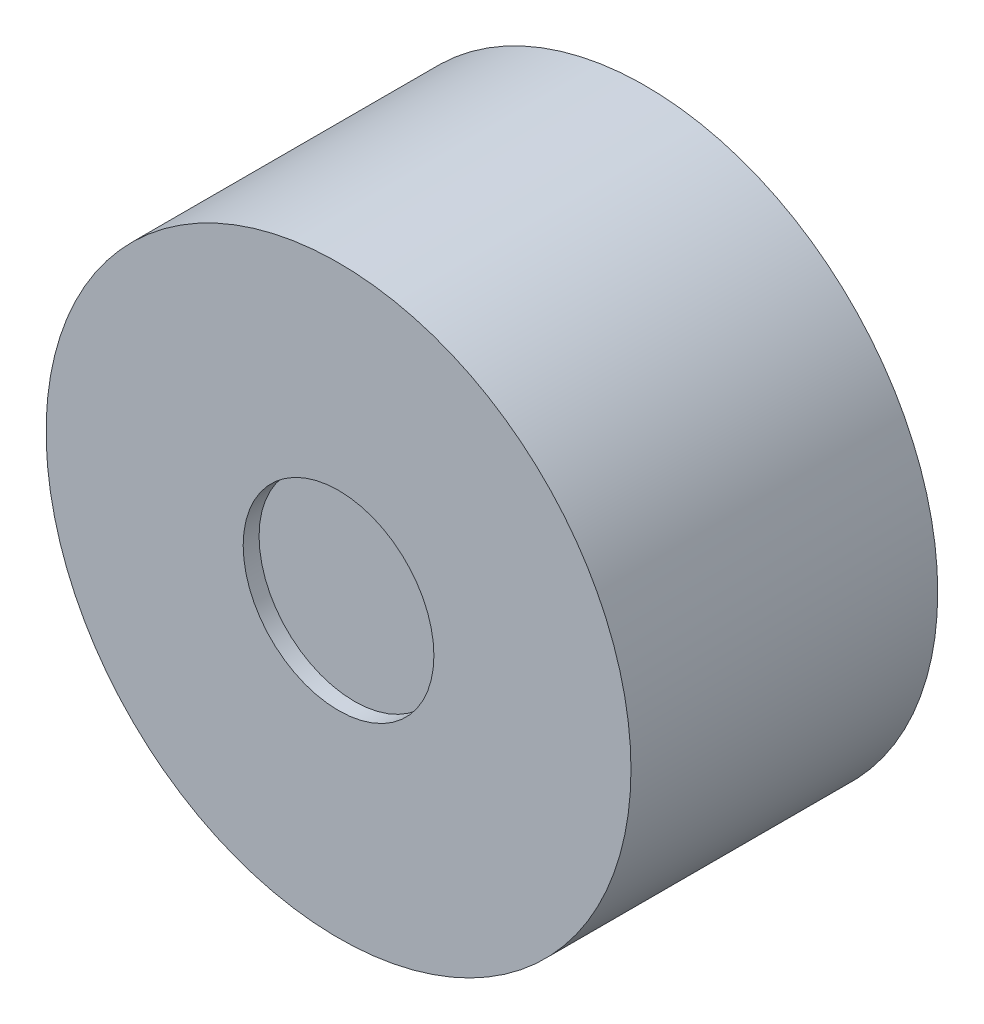
ISO-10303-21;
HEADER;
FILE_DESCRIPTION(('STEP AP214'),'2;1');
FILE_NAME('part.step','',(''),(''),'','','');
FILE_SCHEMA(('AUTOMOTIVE_DESIGN { 1 0 10303 214 1 1 1 1 }'));
ENDSEC;
DATA;
#1=APPLICATION_CONTEXT('core data for automotive mechanical design processes');
#2=APPLICATION_PROTOCOL_DEFINITION('international standard','automotive_design',2000,#1);
#3=PRODUCT_CONTEXT('',#1,'mechanical');
#4=PRODUCT('Part','Part','',(#3));
#5=PRODUCT_RELATED_PRODUCT_CATEGORY('part','',(#4));
#6=PRODUCT_DEFINITION_FORMATION('','',#4);
#7=PRODUCT_DEFINITION_CONTEXT('part definition',#1,'design');
#8=PRODUCT_DEFINITION('design','',#6,#7);
#9=PRODUCT_DEFINITION_SHAPE('','',#8);
#10=(LENGTH_UNIT() NAMED_UNIT(*) SI_UNIT(.MILLI.,.METRE.));
#11=(NAMED_UNIT(*) PLANE_ANGLE_UNIT() SI_UNIT($,.RADIAN.));
#12=(NAMED_UNIT(*) SI_UNIT($,.STERADIAN.) SOLID_ANGLE_UNIT());
#13=UNCERTAINTY_MEASURE_WITH_UNIT(LENGTH_MEASURE(1.E-05),#10,'distance_accuracy_value','');
#14=(GEOMETRIC_REPRESENTATION_CONTEXT(3) GLOBAL_UNCERTAINTY_ASSIGNED_CONTEXT((#13)) GLOBAL_UNIT_ASSIGNED_CONTEXT((#10,
#11,#12)) REPRESENTATION_CONTEXT('',''));
#15=CARTESIAN_POINT('',(0.,0.,0.));
#16=DIRECTION('',(0.,0.,1.));
#17=DIRECTION('',(1.,0.,0.));
#18=AXIS2_PLACEMENT_3D('',#15,#16,#17);
#19=CARTESIAN_POINT('',(0.,0.,24.3));
#20=DIRECTION('',(0.,0.,-1.));
#21=DIRECTION('',(-1.,0.,0.));
#22=AXIS2_PLACEMENT_3D('',#19,#20,#21);
#23=CYLINDRICAL_SURFACE('',#22,18.4);
#24=CARTESIAN_POINT('',(0.,0.,0.));
#25=DIRECTION('',(0.,0.,1.));
#26=DIRECTION('',(1.,0.,0.));
#27=AXIS2_PLACEMENT_3D('',#24,#25,#26);
#28=CIRCLE('',#27,18.4);
#29=CARTESIAN_POINT('',(18.4,0.,0.));
#30=VERTEX_POINT('',#29);
#31=EDGE_CURVE('E10',#30,#30,#28,.T.);
#32=ORIENTED_EDGE('',*,*,#31,.T.);
#33=EDGE_LOOP('',(#32));
#34=FACE_BOUND('',#33,.T.);
#35=CARTESIAN_POINT('',(0.,0.,19.3));
#36=DIRECTION('',(0.,0.,1.));
#37=DIRECTION('',(1.,0.,0.));
#38=AXIS2_PLACEMENT_3D('',#35,#36,#37);
#39=CIRCLE('',#38,18.4);
#40=CARTESIAN_POINT('',(18.4,0.,19.3));
#41=VERTEX_POINT('',#40);
#42=EDGE_CURVE('E53',#41,#41,#39,.T.);
#43=ORIENTED_EDGE('',*,*,#42,.F.);
#44=EDGE_LOOP('',(#43));
#45=FACE_BOUND('',#44,.T.);
#46=ADVANCED_FACE('F35',(#34,#45),#23,.T.);
#47=CARTESIAN_POINT('',(0.,0.,0.));
#48=DIRECTION('',(0.,0.,1.));
#49=DIRECTION('',(1.,0.,0.));
#50=AXIS2_PLACEMENT_3D('',#47,#48,#49);
#51=PLANE('',#50);
#52=CARTESIAN_POINT('',(10.,0.,0.));
#53=DIRECTION('',(0.,0.,-1.));
#54=DIRECTION('',(-1.,0.,0.));
#55=AXIS2_PLACEMENT_3D('',#52,#53,#54);
#56=CIRCLE('',#55,1.25);
#57=CARTESIAN_POINT('',(8.75,0.,0.));
#58=VERTEX_POINT('',#57);
#59=EDGE_CURVE('E45',#58,#58,#56,.T.);
#60=ORIENTED_EDGE('',*,*,#59,.F.);
#61=EDGE_LOOP('',(#60));
#62=FACE_BOUND('',#61,.T.);
#63=CARTESIAN_POINT('',(0.,10.,0.));
#64=DIRECTION('',(0.,0.,-1.));
#65=DIRECTION('',(-1.,0.,0.));
#66=AXIS2_PLACEMENT_3D('',#63,#64,#65);
#67=CIRCLE('',#66,1.25);
#68=CARTESIAN_POINT('',(-1.25000000000003,10.,0.));
#69=VERTEX_POINT('',#68);
#70=EDGE_CURVE('E58',#69,#69,#67,.T.);
#71=ORIENTED_EDGE('',*,*,#70,.F.);
#72=EDGE_LOOP('',(#71));
#73=FACE_BOUND('',#72,.T.);
#74=CARTESIAN_POINT('',(-10.,0.,0.));
#75=DIRECTION('',(0.,0.,-1.));
#76=DIRECTION('',(-1.,0.,0.));
#77=AXIS2_PLACEMENT_3D('',#74,#75,#76);
#78=CIRCLE('',#77,1.25);
#79=CARTESIAN_POINT('',(-11.25,0.,0.));
#80=VERTEX_POINT('',#79);
#81=EDGE_CURVE('E64',#80,#80,#78,.T.);
#82=ORIENTED_EDGE('',*,*,#81,.F.);
#83=EDGE_LOOP('',(#82));
#84=FACE_BOUND('',#83,.T.);
#85=CARTESIAN_POINT('',(1.04744440165294E-13,-10.,0.));
#86=DIRECTION('',(0.,0.,-1.));
#87=DIRECTION('',(-1.,0.,0.));
#88=AXIS2_PLACEMENT_3D('',#85,#86,#87);
#89=CIRCLE('',#88,1.25);
#90=CARTESIAN_POINT('',(-1.24999999999989,-10.,0.));
#91=VERTEX_POINT('',#90);
#92=EDGE_CURVE('E69',#91,#91,#89,.T.);
#93=ORIENTED_EDGE('',*,*,#92,.F.);
#94=EDGE_LOOP('',(#93));
#95=FACE_BOUND('',#94,.T.);
#96=ORIENTED_EDGE('',*,*,#31,.F.);
#97=EDGE_LOOP('',(#96));
#98=FACE_BOUND('',#97,.T.);
#99=ADVANCED_FACE('F102',(#62,#73,#84,#95,#98),#51,.F.);
#100=CARTESIAN_POINT('',(1.04744440165294E-13,-10.,5.));
#101=DIRECTION('',(0.,0.,-1.));
#102=DIRECTION('',(-1.,0.,0.));
#103=AXIS2_PLACEMENT_3D('',#100,#101,#102);
#104=CYLINDRICAL_SURFACE('',#103,1.25);
#105=CARTESIAN_POINT('',(1.04744440165294E-13,-10.,5.));
#106=DIRECTION('',(0.,0.,-1.));
#107=DIRECTION('',(-1.,0.,0.));
#108=AXIS2_PLACEMENT_3D('',#105,#106,#107);
#109=CIRCLE('',#108,1.25);
#110=CARTESIAN_POINT('',(-1.24999999999989,-10.,5.));
#111=VERTEX_POINT('',#110);
#112=EDGE_CURVE('E67',#111,#111,#109,.T.);
#113=ORIENTED_EDGE('',*,*,#112,.F.);
#114=EDGE_LOOP('',(#113));
#115=FACE_BOUND('',#114,.T.);
#116=ORIENTED_EDGE('',*,*,#92,.T.);
#117=EDGE_LOOP('',(#116));
#118=FACE_BOUND('',#117,.T.);
#119=ADVANCED_FACE('F106',(#115,#118),#104,.F.);
#120=CARTESIAN_POINT('',(1.04744440165294E-13,-10.,5.));
#121=DIRECTION('',(0.,0.,-1.));
#122=DIRECTION('',(-1.,0.,0.));
#123=AXIS2_PLACEMENT_3D('',#120,#121,#122);
#124=PLANE('',#123);
#125=ORIENTED_EDGE('',*,*,#112,.T.);
#126=EDGE_LOOP('',(#125));
#127=FACE_BOUND('',#126,.T.);
#128=ADVANCED_FACE('F112',(#127),#124,.T.);
#129=CARTESIAN_POINT('',(-10.,0.,5.));
#130=DIRECTION('',(0.,0.,-1.));
#131=DIRECTION('',(-1.,0.,0.));
#132=AXIS2_PLACEMENT_3D('',#129,#130,#131);
#133=CYLINDRICAL_SURFACE('',#132,1.25);
#134=CARTESIAN_POINT('',(-10.,0.,5.));
#135=DIRECTION('',(0.,0.,-1.));
#136=DIRECTION('',(-1.,0.,0.));
#137=AXIS2_PLACEMENT_3D('',#134,#135,#136);
#138=CIRCLE('',#137,1.25);
#139=CARTESIAN_POINT('',(-11.25,0.,5.));
#140=VERTEX_POINT('',#139);
#141=EDGE_CURVE('E61',#140,#140,#138,.T.);
#142=ORIENTED_EDGE('',*,*,#141,.F.);
#143=EDGE_LOOP('',(#142));
#144=FACE_BOUND('',#143,.T.);
#145=ORIENTED_EDGE('',*,*,#81,.T.);
#146=EDGE_LOOP('',(#145));
#147=FACE_BOUND('',#146,.T.);
#148=ADVANCED_FACE('F122',(#144,#147),#133,.F.);
#149=CARTESIAN_POINT('',(-10.,0.,5.));
#150=DIRECTION('',(0.,0.,-1.));
#151=DIRECTION('',(-1.,0.,0.));
#152=AXIS2_PLACEMENT_3D('',#149,#150,#151);
#153=PLANE('',#152);
#154=ORIENTED_EDGE('',*,*,#141,.T.);
#155=EDGE_LOOP('',(#154));
#156=FACE_BOUND('',#155,.T.);
#157=ADVANCED_FACE('F124',(#156),#153,.T.);
#158=CARTESIAN_POINT('',(0.,10.,5.));
#159=DIRECTION('',(0.,0.,-1.));
#160=DIRECTION('',(-1.,0.,0.));
#161=AXIS2_PLACEMENT_3D('',#158,#159,#160);
#162=CYLINDRICAL_SURFACE('',#161,1.25);
#163=CARTESIAN_POINT('',(0.,10.,5.));
#164=DIRECTION('',(0.,0.,-1.));
#165=DIRECTION('',(-1.,0.,0.));
#166=AXIS2_PLACEMENT_3D('',#163,#164,#165);
#167=CIRCLE('',#166,1.25);
#168=CARTESIAN_POINT('',(-1.25000000000003,10.,5.));
#169=VERTEX_POINT('',#168);
#170=EDGE_CURVE('E50',#169,#169,#167,.T.);
#171=ORIENTED_EDGE('',*,*,#170,.F.);
#172=EDGE_LOOP('',(#171));
#173=FACE_BOUND('',#172,.T.);
#174=ORIENTED_EDGE('',*,*,#70,.T.);
#175=EDGE_LOOP('',(#174));
#176=FACE_BOUND('',#175,.T.);
#177=ADVANCED_FACE('F131',(#173,#176),#162,.F.);
#178=CARTESIAN_POINT('',(0.,10.,5.));
#179=DIRECTION('',(0.,0.,-1.));
#180=DIRECTION('',(-1.,0.,0.));
#181=AXIS2_PLACEMENT_3D('',#178,#179,#180);
#182=PLANE('',#181);
#183=ORIENTED_EDGE('',*,*,#170,.T.);
#184=EDGE_LOOP('',(#183));
#185=FACE_BOUND('',#184,.T.);
#186=ADVANCED_FACE('F140',(#185),#182,.T.);
#187=CARTESIAN_POINT('',(10.,0.,5.));
#188=DIRECTION('',(0.,0.,-1.));
#189=DIRECTION('',(-1.,0.,0.));
#190=AXIS2_PLACEMENT_3D('',#187,#188,#189);
#191=CYLINDRICAL_SURFACE('',#190,1.25);
#192=CARTESIAN_POINT('',(10.,0.,5.));
#193=DIRECTION('',(0.,0.,-1.));
#194=DIRECTION('',(-1.,0.,0.));
#195=AXIS2_PLACEMENT_3D('',#192,#193,#194);
#196=CIRCLE('',#195,1.25);
#197=CARTESIAN_POINT('',(8.75,0.,5.));
#198=VERTEX_POINT('',#197);
#199=EDGE_CURVE('E41',#198,#198,#196,.T.);
#200=ORIENTED_EDGE('',*,*,#199,.F.);
#201=EDGE_LOOP('',(#200));
#202=FACE_BOUND('',#201,.T.);
#203=ORIENTED_EDGE('',*,*,#59,.T.);
#204=EDGE_LOOP('',(#203));
#205=FACE_BOUND('',#204,.T.);
#206=ADVANCED_FACE('F98',(#202,#205),#191,.F.);
#207=CARTESIAN_POINT('',(10.,0.,5.));
#208=DIRECTION('',(0.,0.,-1.));
#209=DIRECTION('',(-1.,0.,0.));
#210=AXIS2_PLACEMENT_3D('',#207,#208,#209);
#211=PLANE('',#210);
#212=ORIENTED_EDGE('',*,*,#199,.T.);
#213=EDGE_LOOP('',(#212));
#214=FACE_BOUND('',#213,.T.);
#215=ADVANCED_FACE('F89',(#214),#211,.T.);
#216=CARTESIAN_POINT('',(0.,9.5,19.3));
#217=DIRECTION('',(0.,0.,1.));
#218=DIRECTION('',(1.,0.,0.));
#219=AXIS2_PLACEMENT_3D('',#216,#217,#218);
#220=PLANE('',#219);
#221=CARTESIAN_POINT('',(0.,0.,19.3));
#222=DIRECTION('',(0.,0.,1.));
#223=DIRECTION('',(1.,0.,0.));
#224=AXIS2_PLACEMENT_3D('',#221,#222,#223);
#225=CIRCLE('',#224,6.);
#226=CARTESIAN_POINT('',(6.,0.,19.3));
#227=VERTEX_POINT('',#226);
#228=EDGE_CURVE('E78',#227,#227,#225,.T.);
#229=ORIENTED_EDGE('',*,*,#228,.F.);
#230=EDGE_LOOP('',(#229));
#231=FACE_BOUND('',#230,.T.);
#232=ORIENTED_EDGE('',*,*,#42,.T.);
#233=EDGE_LOOP('',(#232));
#234=FACE_BOUND('',#233,.T.);
#235=ADVANCED_FACE('F87',(#231,#234),#220,.T.);
#236=CARTESIAN_POINT('',(0.,0.,18.3));
#237=DIRECTION('',(0.,0.,1.));
#238=DIRECTION('',(1.,0.,0.));
#239=AXIS2_PLACEMENT_3D('',#236,#237,#238);
#240=CYLINDRICAL_SURFACE('',#239,6.);
#241=CARTESIAN_POINT('',(0.,0.,18.3));
#242=DIRECTION('',(0.,0.,1.));
#243=DIRECTION('',(1.,0.,0.));
#244=AXIS2_PLACEMENT_3D('',#241,#242,#243);
#245=CIRCLE('',#244,6.);
#246=CARTESIAN_POINT('',(6.,0.,18.3));
#247=VERTEX_POINT('',#246);
#248=EDGE_CURVE('E74',#247,#247,#245,.T.);
#249=ORIENTED_EDGE('',*,*,#248,.F.);
#250=EDGE_LOOP('',(#249));
#251=FACE_BOUND('',#250,.T.);
#252=ORIENTED_EDGE('',*,*,#228,.T.);
#253=EDGE_LOOP('',(#252));
#254=FACE_BOUND('',#253,.T.);
#255=ADVANCED_FACE('F85',(#251,#254),#240,.F.);
#256=CARTESIAN_POINT('',(0.,0.,18.3));
#257=DIRECTION('',(0.,0.,1.));
#258=DIRECTION('',(1.,0.,0.));
#259=AXIS2_PLACEMENT_3D('',#256,#257,#258);
#260=PLANE('',#259);
#261=ORIENTED_EDGE('',*,*,#248,.T.);
#262=EDGE_LOOP('',(#261));
#263=FACE_BOUND('',#262,.T.);
#264=ADVANCED_FACE('F95',(#263),#260,.T.);
#265=CLOSED_SHELL('',(#46,#99,#119,#128,#148,#157,#177,#186,#206,#215,#235,#255,#264));
#266=MANIFOLD_SOLID_BREP('B2',#265);
#267=ADVANCED_BREP_SHAPE_REPRESENTATION('',(#18,#266),#14);
#268=SHAPE_DEFINITION_REPRESENTATION(#9,#267);
ENDSEC;
END-ISO-10303-21;
